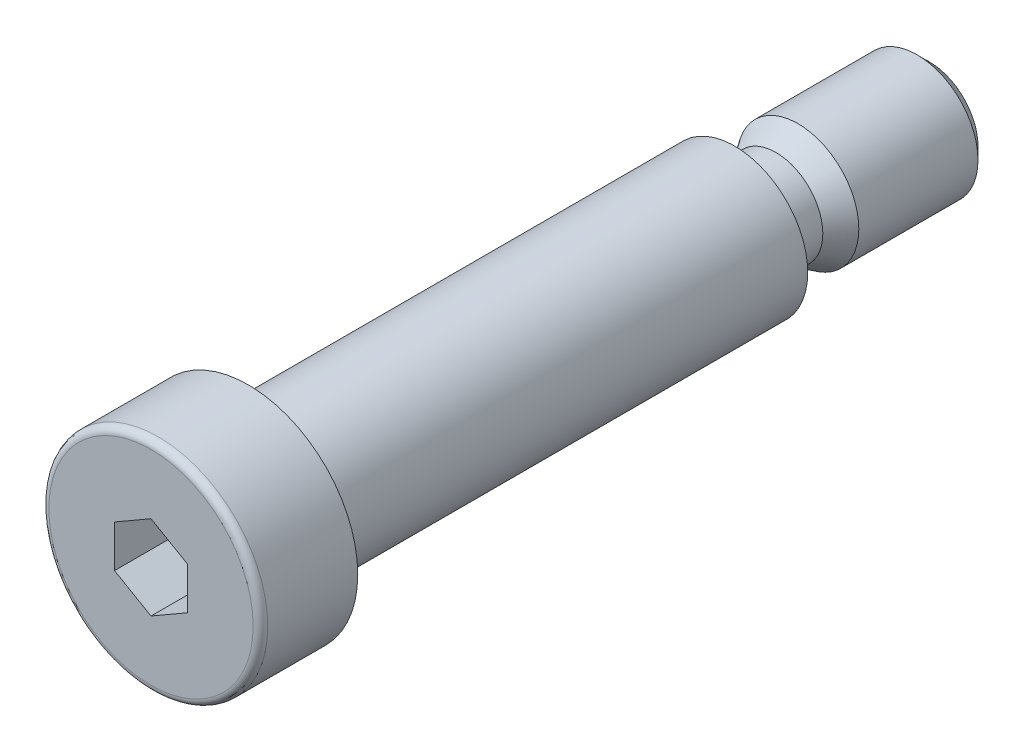
ISO-10303-21;
HEADER;
FILE_DESCRIPTION(('STEP AP214'),'2;1');
FILE_NAME('part.step','',(''),(''),'','','');
FILE_SCHEMA(('AUTOMOTIVE_DESIGN { 1 0 10303 214 1 1 1 1 }'));
ENDSEC;
DATA;
#1=APPLICATION_CONTEXT('core data for automotive mechanical design processes');
#2=APPLICATION_PROTOCOL_DEFINITION('international standard','automotive_design',2000,#1);
#3=PRODUCT_CONTEXT('',#1,'mechanical');
#4=PRODUCT('Part','Part','',(#3));
#5=PRODUCT_RELATED_PRODUCT_CATEGORY('part','',(#4));
#6=PRODUCT_DEFINITION_FORMATION('','',#4);
#7=PRODUCT_DEFINITION_CONTEXT('part definition',#1,'design');
#8=PRODUCT_DEFINITION('design','',#6,#7);
#9=PRODUCT_DEFINITION_SHAPE('','',#8);
#10=(LENGTH_UNIT() NAMED_UNIT(*) SI_UNIT(.MILLI.,.METRE.));
#11=(NAMED_UNIT(*) PLANE_ANGLE_UNIT() SI_UNIT($,.RADIAN.));
#12=(NAMED_UNIT(*) SI_UNIT($,.STERADIAN.) SOLID_ANGLE_UNIT());
#13=UNCERTAINTY_MEASURE_WITH_UNIT(LENGTH_MEASURE(1.E-05),#10,'distance_accuracy_value','');
#14=(GEOMETRIC_REPRESENTATION_CONTEXT(3) GLOBAL_UNCERTAINTY_ASSIGNED_CONTEXT((#13)) GLOBAL_UNIT_ASSIGNED_CONTEXT((#10,
#11,#12)) REPRESENTATION_CONTEXT('',''));
#15=CARTESIAN_POINT('',(0.,0.,0.));
#16=DIRECTION('',(0.,0.,1.));
#17=DIRECTION('',(1.,0.,0.));
#18=AXIS2_PLACEMENT_3D('',#15,#16,#17);
#19=CARTESIAN_POINT('',(0.,0.,28.));
#20=DIRECTION('',(0.,0.,1.));
#21=DIRECTION('',(1.,0.,0.));
#22=AXIS2_PLACEMENT_3D('',#19,#20,#21);
#23=PLANE('',#22);
#24=CARTESIAN_POINT('',(0.,0.,28.));
#25=DIRECTION('',(0.,0.,1.));
#26=DIRECTION('',(1.,0.,0.));
#27=AXIS2_PLACEMENT_3D('',#24,#25,#26);
#28=CIRCLE('',#27,8.4);
#29=CARTESIAN_POINT('',(8.4,0.,28.));
#30=VERTEX_POINT('',#29);
#31=EDGE_CURVE('E43',#30,#30,#28,.T.);
#32=ORIENTED_EDGE('',*,*,#31,.T.);
#33=EDGE_LOOP('',(#32));
#34=FACE_BOUND('',#33,.T.);
#35=DIRECTION('',(0.,1.,0.));
#36=VECTOR('',#35,1.);
#37=CARTESIAN_POINT('',(3.,-1.73205080756888,28.));
#38=LINE('',#37,#36);
#39=CARTESIAN_POINT('',(3.,-1.73205080756888,28.));
#40=VERTEX_POINT('',#39);
#41=CARTESIAN_POINT('',(3.,1.73205080756888,28.));
#42=VERTEX_POINT('',#41);
#43=EDGE_CURVE('E50',#40,#42,#38,.T.);
#44=ORIENTED_EDGE('',*,*,#43,.F.);
#45=DIRECTION('',(0.866025403784439,0.5,0.));
#46=VECTOR('',#45,1.);
#47=CARTESIAN_POINT('',(0.,-3.46410161513775,28.));
#48=LINE('',#47,#46);
#49=CARTESIAN_POINT('',(0.,-3.46410161513775,28.));
#50=VERTEX_POINT('',#49);
#51=EDGE_CURVE('E133',#50,#40,#48,.T.);
#52=ORIENTED_EDGE('',*,*,#51,.F.);
#53=DIRECTION('',(0.866025403784439,-0.5,0.));
#54=VECTOR('',#53,1.);
#55=CARTESIAN_POINT('',(-3.,-1.73205080756888,28.));
#56=LINE('',#55,#54);
#57=CARTESIAN_POINT('',(-3.,-1.73205080756888,28.));
#58=VERTEX_POINT('',#57);
#59=EDGE_CURVE('E131',#58,#50,#56,.T.);
#60=ORIENTED_EDGE('',*,*,#59,.F.);
#61=DIRECTION('',(0.,-1.,0.));
#62=VECTOR('',#61,1.);
#63=CARTESIAN_POINT('',(-3.,1.73205080756888,28.));
#64=LINE('',#63,#62);
#65=CARTESIAN_POINT('',(-3.,1.73205080756888,28.));
#66=VERTEX_POINT('',#65);
#67=EDGE_CURVE('E98',#66,#58,#64,.T.);
#68=ORIENTED_EDGE('',*,*,#67,.F.);
#69=DIRECTION('',(-0.866025403784439,-0.5,0.));
#70=VECTOR('',#69,1.);
#71=CARTESIAN_POINT('',(0.,3.46410161513775,28.));
#72=LINE('',#71,#70);
#73=CARTESIAN_POINT('',(0.,3.46410161513775,28.));
#74=VERTEX_POINT('',#73);
#75=EDGE_CURVE('E127',#74,#66,#72,.T.);
#76=ORIENTED_EDGE('',*,*,#75,.F.);
#77=DIRECTION('',(-0.866025403784439,0.5,0.));
#78=VECTOR('',#77,1.);
#79=CARTESIAN_POINT('',(3.,1.73205080756888,28.));
#80=LINE('',#79,#78);
#81=EDGE_CURVE('E124',#42,#74,#80,.T.);
#82=ORIENTED_EDGE('',*,*,#81,.F.);
#83=EDGE_LOOP('',(#44,#52,#60,#68,#76,#82));
#84=FACE_BOUND('',#83,.T.);
#85=ADVANCED_FACE('F35',(#34,#84),#23,.T.);
#86=CARTESIAN_POINT('',(0.,0.,-36.));
#87=DIRECTION('',(0.,0.,1.));
#88=DIRECTION('',(1.,0.,0.));
#89=AXIS2_PLACEMENT_3D('',#86,#87,#88);
#90=PLANE('',#89);
#91=CARTESIAN_POINT('',(0.,0.,-36.));
#92=DIRECTION('',(0.,0.,1.));
#93=DIRECTION('',(1.,0.,0.));
#94=AXIS2_PLACEMENT_3D('',#91,#92,#93);
#95=CIRCLE('',#94,4.);
#96=CARTESIAN_POINT('',(4.,0.,-36.));
#97=VERTEX_POINT('',#96);
#98=EDGE_CURVE('E163',#97,#97,#95,.T.);
#99=ORIENTED_EDGE('',*,*,#98,.F.);
#100=EDGE_LOOP('',(#99));
#101=FACE_BOUND('',#100,.T.);
#102=ADVANCED_FACE('F179',(#101),#90,.F.);
#103=CARTESIAN_POINT('',(0.,0.,-36.));
#104=DIRECTION('',(0.,0.,1.));
#105=DIRECTION('',(1.,0.,0.));
#106=AXIS2_PLACEMENT_3D('',#103,#104,#105);
#107=CONICAL_SURFACE('',#106,4.,0.785398163397447);
#108=CARTESIAN_POINT('',(0.,0.,-35.));
#109=DIRECTION('',(0.,0.,1.));
#110=DIRECTION('',(1.,0.,0.));
#111=AXIS2_PLACEMENT_3D('',#108,#109,#110);
#112=CIRCLE('',#111,5.);
#113=CARTESIAN_POINT('',(5.,0.,-35.));
#114=VERTEX_POINT('',#113);
#115=EDGE_CURVE('E160',#114,#114,#112,.T.);
#116=ORIENTED_EDGE('',*,*,#115,.F.);
#117=EDGE_LOOP('',(#116));
#118=FACE_BOUND('',#117,.T.);
#119=ORIENTED_EDGE('',*,*,#98,.T.);
#120=EDGE_LOOP('',(#119));
#121=FACE_BOUND('',#120,.T.);
#122=ADVANCED_FACE('F183',(#118,#121),#107,.T.);
#123=CARTESIAN_POINT('',(0.,0.,28.));
#124=DIRECTION('',(0.,0.,1.));
#125=DIRECTION('',(1.,0.,0.));
#126=AXIS2_PLACEMENT_3D('',#123,#124,#125);
#127=CYLINDRICAL_SURFACE('',#126,5.);
#128=CARTESIAN_POINT('',(0.,0.,-25.2));
#129=DIRECTION('',(0.,0.,1.));
#130=DIRECTION('',(1.,0.,0.));
#131=AXIS2_PLACEMENT_3D('',#128,#129,#130);
#132=CIRCLE('',#131,5.);
#133=CARTESIAN_POINT('',(5.,0.,-25.2));
#134=VERTEX_POINT('',#133);
#135=EDGE_CURVE('E157',#134,#134,#132,.T.);
#136=ORIENTED_EDGE('',*,*,#135,.F.);
#137=EDGE_LOOP('',(#136));
#138=FACE_BOUND('',#137,.T.);
#139=ORIENTED_EDGE('',*,*,#115,.T.);
#140=EDGE_LOOP('',(#139));
#141=FACE_BOUND('',#140,.T.);
#142=ADVANCED_FACE('F189',(#138,#141),#127,.T.);
#143=CARTESIAN_POINT('',(0.,0.,-25.2));
#144=DIRECTION('',(0.,0.,-1.));
#145=DIRECTION('',(-1.,0.,0.));
#146=AXIS2_PLACEMENT_3D('',#143,#144,#145);
#147=CONICAL_SURFACE('',#146,5.,0.566013910063244);
#148=CARTESIAN_POINT('',(0.,0.,-23.39));
#149=DIRECTION('',(0.,0.,1.));
#150=DIRECTION('',(1.,0.,0.));
#151=AXIS2_PLACEMENT_3D('',#148,#149,#150);
#152=CIRCLE('',#151,3.85000000000001);
#153=CARTESIAN_POINT('',(3.85000000000001,0.,-23.39));
#154=VERTEX_POINT('',#153);
#155=EDGE_CURVE('E154',#154,#154,#152,.T.);
#156=ORIENTED_EDGE('',*,*,#155,.F.);
#157=EDGE_LOOP('',(#156));
#158=FACE_BOUND('',#157,.T.);
#159=ORIENTED_EDGE('',*,*,#135,.T.);
#160=EDGE_LOOP('',(#159));
#161=FACE_BOUND('',#160,.T.);
#162=ADVANCED_FACE('F193',(#158,#161),#147,.T.);
#163=CARTESIAN_POINT('',(0.,0.,28.));
#164=DIRECTION('',(0.,0.,1.));
#165=DIRECTION('',(1.,0.,0.));
#166=AXIS2_PLACEMENT_3D('',#163,#164,#165);
#167=CYLINDRICAL_SURFACE('',#166,3.85000000000001);
#168=ORIENTED_EDGE('',*,*,#155,.T.);
#169=EDGE_LOOP('',(#168));
#170=FACE_BOUND('',#169,.T.);
#171=CARTESIAN_POINT('',(0.,0.,-20.));
#172=DIRECTION('',(0.,0.,1.));
#173=DIRECTION('',(1.,0.,0.));
#174=AXIS2_PLACEMENT_3D('',#171,#172,#173);
#175=CIRCLE('',#174,3.85);
#176=CARTESIAN_POINT('',(3.85,0.,-20.));
#177=VERTEX_POINT('',#176);
#178=EDGE_CURVE('E151',#177,#177,#175,.T.);
#179=ORIENTED_EDGE('',*,*,#178,.F.);
#180=EDGE_LOOP('',(#179));
#181=FACE_BOUND('',#180,.T.);
#182=ADVANCED_FACE('F197',(#170,#181),#167,.T.);
#183=CARTESIAN_POINT('',(0.,0.,-20.));
#184=DIRECTION('',(0.,0.,1.));
#185=DIRECTION('',(1.,0.,0.));
#186=AXIS2_PLACEMENT_3D('',#183,#184,#185);
#187=PLANE('',#186);
#188=CARTESIAN_POINT('',(0.,0.,-20.));
#189=DIRECTION('',(0.,0.,1.));
#190=DIRECTION('',(1.,0.,0.));
#191=AXIS2_PLACEMENT_3D('',#188,#189,#190);
#192=CIRCLE('',#191,6.);
#193=CARTESIAN_POINT('',(6.,0.,-20.));
#194=VERTEX_POINT('',#193);
#195=EDGE_CURVE('E148',#194,#194,#192,.T.);
#196=ORIENTED_EDGE('',*,*,#195,.F.);
#197=EDGE_LOOP('',(#196));
#198=FACE_BOUND('',#197,.T.);
#199=ORIENTED_EDGE('',*,*,#178,.T.);
#200=EDGE_LOOP('',(#199));
#201=FACE_BOUND('',#200,.T.);
#202=ADVANCED_FACE('F201',(#198,#201),#187,.F.);
#203=CARTESIAN_POINT('',(0.,0.,28.));
#204=DIRECTION('',(0.,0.,1.));
#205=DIRECTION('',(1.,0.,0.));
#206=AXIS2_PLACEMENT_3D('',#203,#204,#205);
#207=CYLINDRICAL_SURFACE('',#206,6.);
#208=ORIENTED_EDGE('',*,*,#195,.T.);
#209=EDGE_LOOP('',(#208));
#210=FACE_BOUND('',#209,.T.);
#211=CARTESIAN_POINT('',(0.,0.,20.));
#212=DIRECTION('',(0.,0.,1.));
#213=DIRECTION('',(1.,0.,0.));
#214=AXIS2_PLACEMENT_3D('',#211,#212,#213);
#215=CIRCLE('',#214,6.);
#216=CARTESIAN_POINT('',(6.,0.,20.));
#217=VERTEX_POINT('',#216);
#218=EDGE_CURVE('E145',#217,#217,#215,.T.);
#219=ORIENTED_EDGE('',*,*,#218,.F.);
#220=EDGE_LOOP('',(#219));
#221=FACE_BOUND('',#220,.T.);
#222=ADVANCED_FACE('F205',(#210,#221),#207,.T.);
#223=CARTESIAN_POINT('',(0.,0.,20.));
#224=DIRECTION('',(0.,0.,1.));
#225=DIRECTION('',(1.,0.,0.));
#226=AXIS2_PLACEMENT_3D('',#223,#224,#225);
#227=PLANE('',#226);
#228=CARTESIAN_POINT('',(0.,0.,20.));
#229=DIRECTION('',(0.,0.,1.));
#230=DIRECTION('',(1.,0.,0.));
#231=AXIS2_PLACEMENT_3D('',#228,#229,#230);
#232=CIRCLE('',#231,9.);
#233=CARTESIAN_POINT('',(9.,0.,20.));
#234=VERTEX_POINT('',#233);
#235=EDGE_CURVE('E137',#234,#234,#232,.T.);
#236=ORIENTED_EDGE('',*,*,#235,.F.);
#237=EDGE_LOOP('',(#236));
#238=FACE_BOUND('',#237,.T.);
#239=ORIENTED_EDGE('',*,*,#218,.T.);
#240=EDGE_LOOP('',(#239));
#241=FACE_BOUND('',#240,.T.);
#242=ADVANCED_FACE('F209',(#238,#241),#227,.F.);
#243=CARTESIAN_POINT('',(0.,0.,28.));
#244=DIRECTION('',(0.,0.,1.));
#245=DIRECTION('',(1.,0.,0.));
#246=AXIS2_PLACEMENT_3D('',#243,#244,#245);
#247=CYLINDRICAL_SURFACE('',#246,9.);
#248=CARTESIAN_POINT('',(0.,0.,27.4));
#249=DIRECTION('',(0.,0.,1.));
#250=DIRECTION('',(1.,0.,0.));
#251=AXIS2_PLACEMENT_3D('',#248,#249,#250);
#252=CIRCLE('',#251,9.);
#253=CARTESIAN_POINT('',(9.,0.,27.4));
#254=VERTEX_POINT('',#253);
#255=EDGE_CURVE('E11',#254,#254,#252,.F.);
#256=ORIENTED_EDGE('',*,*,#255,.T.);
#257=EDGE_LOOP('',(#256));
#258=FACE_BOUND('',#257,.T.);
#259=ORIENTED_EDGE('',*,*,#235,.T.);
#260=EDGE_LOOP('',(#259));
#261=FACE_BOUND('',#260,.T.);
#262=ADVANCED_FACE('F213',(#258,#261),#247,.T.);
#263=CARTESIAN_POINT('',(3.,-1.73205080756888,23.1));
#264=DIRECTION('',(1.,0.,0.));
#265=DIRECTION('',(0.,1.,0.));
#266=AXIS2_PLACEMENT_3D('',#263,#264,#265);
#267=PLANE('',#266);
#268=ORIENTED_EDGE('',*,*,#43,.T.);
#269=DIRECTION('',(0.,0.,1.));
#270=VECTOR('',#269,1.);
#271=CARTESIAN_POINT('',(3.,1.73205080756888,23.1));
#272=LINE('',#271,#270);
#273=CARTESIAN_POINT('',(3.,1.73205080756888,23.1));
#274=VERTEX_POINT('',#273);
#275=EDGE_CURVE('E80',#274,#42,#272,.T.);
#276=ORIENTED_EDGE('',*,*,#275,.F.);
#277=DIRECTION('',(0.,1.,0.));
#278=VECTOR('',#277,1.);
#279=CARTESIAN_POINT('',(3.,-1.73205080756888,23.1));
#280=LINE('',#279,#278);
#281=CARTESIAN_POINT('',(3.,-1.73205080756888,23.1));
#282=VERTEX_POINT('',#281);
#283=EDGE_CURVE('E135',#282,#274,#280,.T.);
#284=ORIENTED_EDGE('',*,*,#283,.F.);
#285=DIRECTION('',(0.,0.,1.));
#286=VECTOR('',#285,1.);
#287=CARTESIAN_POINT('',(3.,-1.73205080756888,23.1));
#288=LINE('',#287,#286);
#289=EDGE_CURVE('E58',#282,#40,#288,.T.);
#290=ORIENTED_EDGE('',*,*,#289,.T.);
#291=EDGE_LOOP('',(#268,#276,#284,#290));
#292=FACE_BOUND('',#291,.T.);
#293=ADVANCED_FACE('F217',(#292),#267,.F.);
#294=CARTESIAN_POINT('',(0.,-3.46410161513775,23.1));
#295=DIRECTION('',(0.5,-0.866025403784439,0.));
#296=DIRECTION('',(0.866025403784439,0.5,0.));
#297=AXIS2_PLACEMENT_3D('',#294,#295,#296);
#298=PLANE('',#297);
#299=ORIENTED_EDGE('',*,*,#51,.T.);
#300=ORIENTED_EDGE('',*,*,#289,.F.);
#301=DIRECTION('',(0.866025403784439,0.5,0.));
#302=VECTOR('',#301,1.);
#303=CARTESIAN_POINT('',(0.,-3.46410161513775,23.1));
#304=LINE('',#303,#302);
#305=CARTESIAN_POINT('',(0.,-3.46410161513775,23.1));
#306=VERTEX_POINT('',#305);
#307=EDGE_CURVE('E110',#306,#282,#304,.T.);
#308=ORIENTED_EDGE('',*,*,#307,.F.);
#309=DIRECTION('',(0.,0.,1.));
#310=VECTOR('',#309,1.);
#311=CARTESIAN_POINT('',(0.,-3.46410161513775,23.1));
#312=LINE('',#311,#310);
#313=EDGE_CURVE('E102',#306,#50,#312,.T.);
#314=ORIENTED_EDGE('',*,*,#313,.T.);
#315=EDGE_LOOP('',(#299,#300,#308,#314));
#316=FACE_BOUND('',#315,.T.);
#317=ADVANCED_FACE('F221',(#316),#298,.F.);
#318=CARTESIAN_POINT('',(-3.,-1.73205080756888,23.1));
#319=DIRECTION('',(-0.5,-0.866025403784439,0.));
#320=DIRECTION('',(0.866025403784439,-0.5,0.));
#321=AXIS2_PLACEMENT_3D('',#318,#319,#320);
#322=PLANE('',#321);
#323=ORIENTED_EDGE('',*,*,#59,.T.);
#324=ORIENTED_EDGE('',*,*,#313,.F.);
#325=DIRECTION('',(0.866025403784439,-0.5,0.));
#326=VECTOR('',#325,1.);
#327=CARTESIAN_POINT('',(-3.,-1.73205080756888,23.1));
#328=LINE('',#327,#326);
#329=CARTESIAN_POINT('',(-3.,-1.73205080756888,23.1));
#330=VERTEX_POINT('',#329);
#331=EDGE_CURVE('E106',#330,#306,#328,.T.);
#332=ORIENTED_EDGE('',*,*,#331,.F.);
#333=DIRECTION('',(0.,0.,1.));
#334=VECTOR('',#333,1.);
#335=CARTESIAN_POINT('',(-3.,-1.73205080756888,23.1));
#336=LINE('',#335,#334);
#337=EDGE_CURVE('E91',#330,#58,#336,.T.);
#338=ORIENTED_EDGE('',*,*,#337,.T.);
#339=EDGE_LOOP('',(#323,#324,#332,#338));
#340=FACE_BOUND('',#339,.T.);
#341=ADVANCED_FACE('F107',(#340),#322,.F.);
#342=CARTESIAN_POINT('',(-3.,1.73205080756888,23.1));
#343=DIRECTION('',(-1.,0.,0.));
#344=DIRECTION('',(0.,0.,1.));
#345=AXIS2_PLACEMENT_3D('',#342,#343,#344);
#346=PLANE('',#345);
#347=ORIENTED_EDGE('',*,*,#67,.T.);
#348=ORIENTED_EDGE('',*,*,#337,.F.);
#349=DIRECTION('',(0.,-1.,0.));
#350=VECTOR('',#349,1.);
#351=CARTESIAN_POINT('',(-3.,1.73205080756888,23.1));
#352=LINE('',#351,#350);
#353=CARTESIAN_POINT('',(-3.,1.73205080756888,23.1));
#354=VERTEX_POINT('',#353);
#355=EDGE_CURVE('E95',#354,#330,#352,.T.);
#356=ORIENTED_EDGE('',*,*,#355,.F.);
#357=DIRECTION('',(0.,0.,1.));
#358=VECTOR('',#357,1.);
#359=CARTESIAN_POINT('',(-3.,1.73205080756888,23.1));
#360=LINE('',#359,#358);
#361=EDGE_CURVE('E103',#354,#66,#360,.T.);
#362=ORIENTED_EDGE('',*,*,#361,.T.);
#363=EDGE_LOOP('',(#347,#348,#356,#362));
#364=FACE_BOUND('',#363,.T.);
#365=ADVANCED_FACE('F93',(#364),#346,.F.);
#366=CARTESIAN_POINT('',(0.,3.46410161513775,23.1));
#367=DIRECTION('',(-0.5,0.866025403784439,0.));
#368=DIRECTION('',(-0.866025403784439,-0.5,0.));
#369=AXIS2_PLACEMENT_3D('',#366,#367,#368);
#370=PLANE('',#369);
#371=ORIENTED_EDGE('',*,*,#75,.T.);
#372=ORIENTED_EDGE('',*,*,#361,.F.);
#373=DIRECTION('',(-0.866025403784439,-0.5,0.));
#374=VECTOR('',#373,1.);
#375=CARTESIAN_POINT('',(0.,3.46410161513775,23.1));
#376=LINE('',#375,#374);
#377=CARTESIAN_POINT('',(0.,3.46410161513775,23.1));
#378=VERTEX_POINT('',#377);
#379=EDGE_CURVE('E116',#378,#354,#376,.T.);
#380=ORIENTED_EDGE('',*,*,#379,.F.);
#381=DIRECTION('',(0.,0.,1.));
#382=VECTOR('',#381,1.);
#383=CARTESIAN_POINT('',(0.,3.46410161513775,23.1));
#384=LINE('',#383,#382);
#385=EDGE_CURVE('E140',#378,#74,#384,.T.);
#386=ORIENTED_EDGE('',*,*,#385,.T.);
#387=EDGE_LOOP('',(#371,#372,#380,#386));
#388=FACE_BOUND('',#387,.T.);
#389=ADVANCED_FACE('F224',(#388),#370,.F.);
#390=CARTESIAN_POINT('',(3.,1.73205080756888,23.1));
#391=DIRECTION('',(0.5,0.866025403784439,0.));
#392=DIRECTION('',(-0.866025403784439,0.5,0.));
#393=AXIS2_PLACEMENT_3D('',#390,#391,#392);
#394=PLANE('',#393);
#395=ORIENTED_EDGE('',*,*,#81,.T.);
#396=ORIENTED_EDGE('',*,*,#385,.F.);
#397=DIRECTION('',(-0.866025403784439,0.5,0.));
#398=VECTOR('',#397,1.);
#399=CARTESIAN_POINT('',(3.,1.73205080756888,23.1));
#400=LINE('',#399,#398);
#401=EDGE_CURVE('E118',#274,#378,#400,.T.);
#402=ORIENTED_EDGE('',*,*,#401,.F.);
#403=ORIENTED_EDGE('',*,*,#275,.T.);
#404=EDGE_LOOP('',(#395,#396,#402,#403));
#405=FACE_BOUND('',#404,.T.);
#406=ADVANCED_FACE('F175',(#405),#394,.F.);
#407=CARTESIAN_POINT('',(0.,0.,23.1));
#408=DIRECTION('',(0.,0.,1.));
#409=DIRECTION('',(1.,0.,0.));
#410=AXIS2_PLACEMENT_3D('',#407,#408,#409);
#411=PLANE('',#410);
#412=ORIENTED_EDGE('',*,*,#283,.T.);
#413=ORIENTED_EDGE('',*,*,#401,.T.);
#414=ORIENTED_EDGE('',*,*,#379,.T.);
#415=ORIENTED_EDGE('',*,*,#355,.T.);
#416=ORIENTED_EDGE('',*,*,#331,.T.);
#417=ORIENTED_EDGE('',*,*,#307,.T.);
#418=EDGE_LOOP('',(#412,#413,#414,#415,#416,#417));
#419=FACE_BOUND('',#418,.T.);
#420=ADVANCED_FACE('F113',(#419),#411,.T.);
#421=CARTESIAN_POINT('',(0.,0.,27.4));
#422=DIRECTION('',(0.,0.,1.));
#423=DIRECTION('',(1.,0.,0.));
#424=AXIS2_PLACEMENT_3D('',#421,#422,#423);
#425=TOROIDAL_SURFACE('',#424,8.4,0.6);
#426=ORIENTED_EDGE('',*,*,#255,.F.);
#427=EDGE_LOOP('',(#426));
#428=FACE_BOUND('',#427,.T.);
#429=ORIENTED_EDGE('',*,*,#31,.F.);
#430=EDGE_LOOP('',(#429));
#431=FACE_BOUND('',#430,.T.);
#432=ADVANCED_FACE('F37',(#428,#431),#425,.T.);
#433=CLOSED_SHELL('',(#85,#102,#122,#142,#162,#182,#202,#222,#242,#262,#293,#317,#341,#365,#389,
#406,#420,#432));
#434=MANIFOLD_SOLID_BREP('B2',#433);
#435=ADVANCED_BREP_SHAPE_REPRESENTATION('',(#18,#434),#14);
#436=SHAPE_DEFINITION_REPRESENTATION(#9,#435);
ENDSEC;
END-ISO-10303-21;
